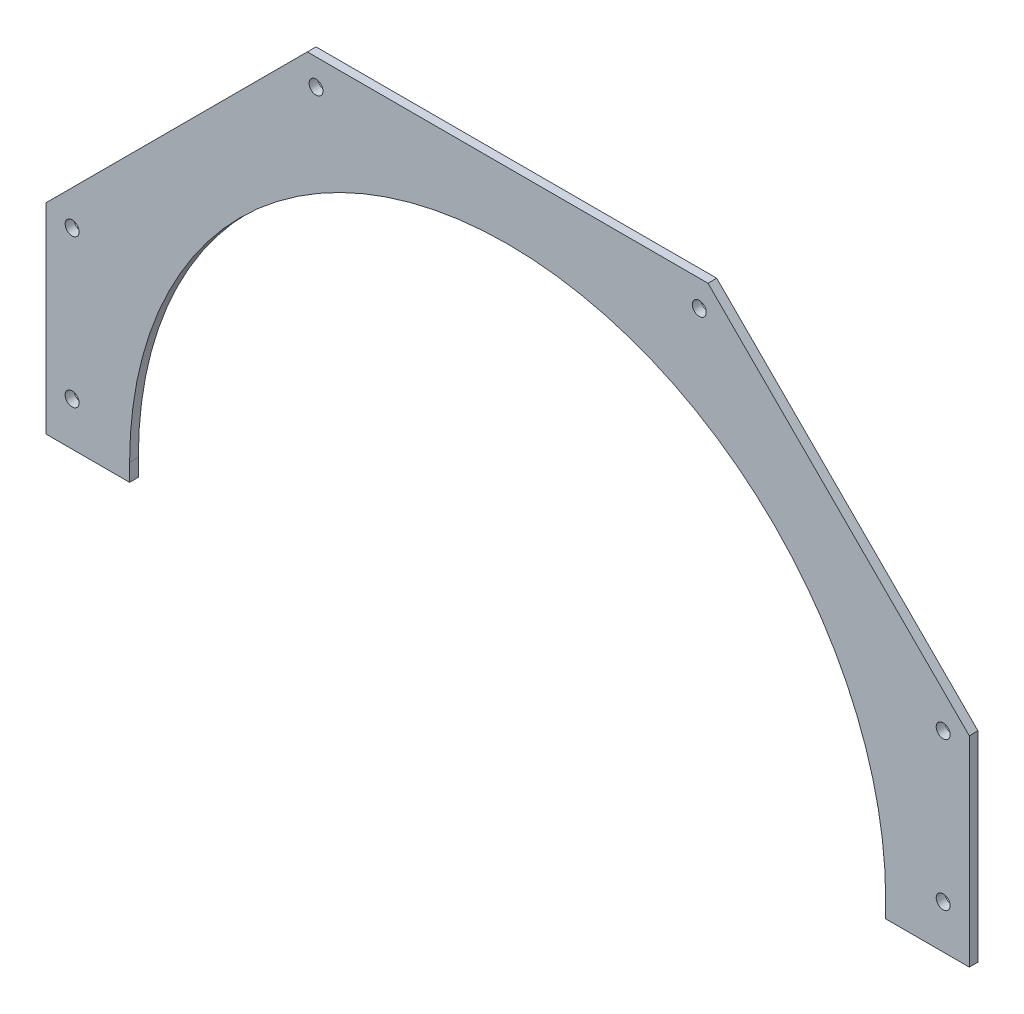
ISO-10303-21;
HEADER;
FILE_DESCRIPTION(('STEP AP214'),'2;1');
FILE_NAME('part.step','',(''),(''),'','','');
FILE_SCHEMA(('AUTOMOTIVE_DESIGN { 1 0 10303 214 1 1 1 1 }'));
ENDSEC;
DATA;
#1=APPLICATION_CONTEXT('core data for automotive mechanical design processes');
#2=APPLICATION_PROTOCOL_DEFINITION('international standard','automotive_design',2000,#1);
#3=PRODUCT_CONTEXT('',#1,'mechanical');
#4=PRODUCT('Part','Part','',(#3));
#5=PRODUCT_RELATED_PRODUCT_CATEGORY('part','',(#4));
#6=PRODUCT_DEFINITION_FORMATION('','',#4);
#7=PRODUCT_DEFINITION_CONTEXT('part definition',#1,'design');
#8=PRODUCT_DEFINITION('design','',#6,#7);
#9=PRODUCT_DEFINITION_SHAPE('','',#8);
#10=(LENGTH_UNIT() NAMED_UNIT(*) SI_UNIT(.MILLI.,.METRE.));
#11=(NAMED_UNIT(*) PLANE_ANGLE_UNIT() SI_UNIT($,.RADIAN.));
#12=(NAMED_UNIT(*) SI_UNIT($,.STERADIAN.) SOLID_ANGLE_UNIT());
#13=UNCERTAINTY_MEASURE_WITH_UNIT(LENGTH_MEASURE(1.E-05),#10,'distance_accuracy_value','');
#14=(GEOMETRIC_REPRESENTATION_CONTEXT(3) GLOBAL_UNCERTAINTY_ASSIGNED_CONTEXT((#13)) GLOBAL_UNIT_ASSIGNED_CONTEXT((#10,
#11,#12)) REPRESENTATION_CONTEXT('',''));
#15=CARTESIAN_POINT('',(0.,0.,0.));
#16=DIRECTION('',(0.,0.,1.));
#17=DIRECTION('',(1.,0.,0.));
#18=AXIS2_PLACEMENT_3D('',#15,#16,#17);
#19=CARTESIAN_POINT('',(0.,0.,10.));
#20=DIRECTION('',(0.,1.,0.));
#21=DIRECTION('',(0.,0.,1.));
#22=AXIS2_PLACEMENT_3D('',#19,#20,#21);
#23=PLANE('',#22);
#24=DIRECTION('',(1.,0.,0.));
#25=VECTOR('',#24,1.);
#26=CARTESIAN_POINT('',(0.,0.,10.));
#27=LINE('',#26,#25);
#28=CARTESIAN_POINT('',(964.,1.0629934216599E-13,10.));
#29=VERTEX_POINT('',#28);
#30=CARTESIAN_POINT('',(1060.,0.,10.));
#31=VERTEX_POINT('',#30);
#32=EDGE_CURVE('E161',#29,#31,#27,.T.);
#33=ORIENTED_EDGE('',*,*,#32,.F.);
#34=DIRECTION('',(0.,0.,1.));
#35=VECTOR('',#34,1.);
#36=CARTESIAN_POINT('',(964.,1.0629934216599E-13,0.));
#37=LINE('',#36,#35);
#38=CARTESIAN_POINT('',(964.,1.0629934216599E-13,0.));
#39=VERTEX_POINT('',#38);
#40=EDGE_CURVE('E156',#39,#29,#37,.T.);
#41=ORIENTED_EDGE('',*,*,#40,.F.);
#42=DIRECTION('',(1.,0.,0.));
#43=VECTOR('',#42,1.);
#44=CARTESIAN_POINT('',(0.,0.,0.));
#45=LINE('',#44,#43);
#46=CARTESIAN_POINT('',(1060.,0.,0.));
#47=VERTEX_POINT('',#46);
#48=EDGE_CURVE('E172',#39,#47,#45,.T.);
#49=ORIENTED_EDGE('',*,*,#48,.T.);
#50=DIRECTION('',(0.,0.,-1.));
#51=VECTOR('',#50,1.);
#52=CARTESIAN_POINT('',(1060.,0.,10.));
#53=LINE('',#52,#51);
#54=EDGE_CURVE('E170',#31,#47,#53,.T.);
#55=ORIENTED_EDGE('',*,*,#54,.F.);
#56=EDGE_LOOP('',(#33,#41,#49,#55));
#57=FACE_BOUND('',#56,.T.);
#58=ADVANCED_FACE('F35',(#57),#23,.F.);
#59=CARTESIAN_POINT('',(0.,0.,10.));
#60=DIRECTION('',(1.,0.,0.));
#61=DIRECTION('',(0.,0.,-1.));
#62=AXIS2_PLACEMENT_3D('',#59,#60,#61);
#63=PLANE('',#62);
#64=DIRECTION('',(0.,-1.,0.));
#65=VECTOR('',#64,1.);
#66=CARTESIAN_POINT('',(0.,0.,10.));
#67=LINE('',#66,#65);
#68=CARTESIAN_POINT('',(0.,230.,10.));
#69=VERTEX_POINT('',#68);
#70=CARTESIAN_POINT('',(0.,0.,10.));
#71=VERTEX_POINT('',#70);
#72=EDGE_CURVE('E159',#69,#71,#67,.T.);
#73=ORIENTED_EDGE('',*,*,#72,.F.);
#74=DIRECTION('',(0.,0.,-1.));
#75=VECTOR('',#74,1.);
#76=CARTESIAN_POINT('',(0.,230.,10.));
#77=LINE('',#76,#75);
#78=CARTESIAN_POINT('',(0.,230.,0.));
#79=VERTEX_POINT('',#78);
#80=EDGE_CURVE('E183',#69,#79,#77,.T.);
#81=ORIENTED_EDGE('',*,*,#80,.T.);
#82=DIRECTION('',(0.,-1.,0.));
#83=VECTOR('',#82,1.);
#84=CARTESIAN_POINT('',(0.,0.,0.));
#85=LINE('',#84,#83);
#86=CARTESIAN_POINT('',(0.,0.,0.));
#87=VERTEX_POINT('',#86);
#88=EDGE_CURVE('E155',#79,#87,#85,.T.);
#89=ORIENTED_EDGE('',*,*,#88,.T.);
#90=DIRECTION('',(0.,0.,-1.));
#91=VECTOR('',#90,1.);
#92=CARTESIAN_POINT('',(0.,0.,10.));
#93=LINE('',#92,#91);
#94=EDGE_CURVE('E180',#71,#87,#93,.T.);
#95=ORIENTED_EDGE('',*,*,#94,.F.);
#96=EDGE_LOOP('',(#73,#81,#89,#95));
#97=FACE_BOUND('',#96,.T.);
#98=ADVANCED_FACE('F248',(#97),#63,.F.);
#99=CARTESIAN_POINT('',(96.0000000000001,0.,0.));
#100=VERTEX_POINT('',#99);
#101=EDGE_CURVE('E173',#87,#100,#45,.T.);
#102=ORIENTED_EDGE('',*,*,#101,.T.);
#103=DIRECTION('',(0.,0.,1.));
#104=VECTOR('',#103,1.);
#105=CARTESIAN_POINT('',(96.0000000000001,0.,0.));
#106=LINE('',#105,#104);
#107=CARTESIAN_POINT('',(96.0000000000001,0.,10.));
#108=VERTEX_POINT('',#107);
#109=EDGE_CURVE('E126',#100,#108,#106,.T.);
#110=ORIENTED_EDGE('',*,*,#109,.T.);
#111=EDGE_CURVE('E163',#71,#108,#27,.T.);
#112=ORIENTED_EDGE('',*,*,#111,.F.);
#113=ORIENTED_EDGE('',*,*,#94,.T.);
#114=EDGE_LOOP('',(#102,#110,#112,#113));
#115=FACE_BOUND('',#114,.T.);
#116=ADVANCED_FACE('F253',(#115),#23,.F.);
#117=CARTESIAN_POINT('',(1060.,0.,10.));
#118=DIRECTION('',(-1.,0.,0.));
#119=DIRECTION('',(0.,0.,1.));
#120=AXIS2_PLACEMENT_3D('',#117,#118,#119);
#121=PLANE('',#120);
#122=DIRECTION('',(0.,1.,0.));
#123=VECTOR('',#122,1.);
#124=CARTESIAN_POINT('',(1060.,0.,0.));
#125=LINE('',#124,#123);
#126=CARTESIAN_POINT('',(1060.,229.999999999999,0.));
#127=VERTEX_POINT('',#126);
#128=EDGE_CURVE('E175',#47,#127,#125,.T.);
#129=ORIENTED_EDGE('',*,*,#128,.T.);
#130=DIRECTION('',(0.,0.,1.));
#131=VECTOR('',#130,1.);
#132=CARTESIAN_POINT('',(1060.,229.999999999999,10.));
#133=LINE('',#132,#131);
#134=CARTESIAN_POINT('',(1060.,229.999999999999,10.));
#135=VERTEX_POINT('',#134);
#136=EDGE_CURVE('E11',#127,#135,#133,.T.);
#137=ORIENTED_EDGE('',*,*,#136,.T.);
#138=DIRECTION('',(0.,1.,0.));
#139=VECTOR('',#138,1.);
#140=CARTESIAN_POINT('',(1060.,0.,10.));
#141=LINE('',#140,#139);
#142=EDGE_CURVE('E166',#31,#135,#141,.T.);
#143=ORIENTED_EDGE('',*,*,#142,.F.);
#144=ORIENTED_EDGE('',*,*,#54,.T.);
#145=EDGE_LOOP('',(#129,#137,#143,#144));
#146=FACE_BOUND('',#145,.T.);
#147=ADVANCED_FACE('F261',(#146),#121,.F.);
#148=CARTESIAN_POINT('',(0.,530.,10.));
#149=DIRECTION('',(0.,-1.,0.));
#150=DIRECTION('',(0.,0.,-1.));
#151=AXIS2_PLACEMENT_3D('',#148,#149,#150);
#152=PLANE('',#151);
#153=DIRECTION('',(-1.,0.,0.));
#154=VECTOR('',#153,1.);
#155=CARTESIAN_POINT('',(0.,530.,0.));
#156=LINE('',#155,#154);
#157=CARTESIAN_POINT('',(760.,530.,0.));
#158=VERTEX_POINT('',#157);
#159=CARTESIAN_POINT('',(300.000000000001,530.,0.));
#160=VERTEX_POINT('',#159);
#161=EDGE_CURVE('E162',#158,#160,#156,.T.);
#162=ORIENTED_EDGE('',*,*,#161,.T.);
#163=DIRECTION('',(0.,0.,1.));
#164=VECTOR('',#163,1.);
#165=CARTESIAN_POINT('',(300.000000000001,530.,10.));
#166=LINE('',#165,#164);
#167=CARTESIAN_POINT('',(300.000000000001,530.,10.));
#168=VERTEX_POINT('',#167);
#169=EDGE_CURVE('E58',#160,#168,#166,.T.);
#170=ORIENTED_EDGE('',*,*,#169,.T.);
#171=DIRECTION('',(-1.,0.,0.));
#172=VECTOR('',#171,1.);
#173=CARTESIAN_POINT('',(0.,530.,10.));
#174=LINE('',#173,#172);
#175=CARTESIAN_POINT('',(760.,530.,10.));
#176=VERTEX_POINT('',#175);
#177=EDGE_CURVE('E168',#176,#168,#174,.T.);
#178=ORIENTED_EDGE('',*,*,#177,.F.);
#179=DIRECTION('',(0.,0.,-1.));
#180=VECTOR('',#179,1.);
#181=CARTESIAN_POINT('',(760.,530.,10.));
#182=LINE('',#181,#180);
#183=EDGE_CURVE('E190',#176,#158,#182,.T.);
#184=ORIENTED_EDGE('',*,*,#183,.T.);
#185=EDGE_LOOP('',(#162,#170,#178,#184));
#186=FACE_BOUND('',#185,.T.);
#187=ADVANCED_FACE('F234',(#186),#152,.F.);
#188=CARTESIAN_POINT('',(0.,0.,10.));
#189=DIRECTION('',(0.,0.,-1.));
#190=DIRECTION('',(-1.,0.,0.));
#191=AXIS2_PLACEMENT_3D('',#188,#189,#190);
#192=PLANE('',#191);
#193=CARTESIAN_POINT('',(30.,220.,10.));
#194=DIRECTION('',(0.,0.,1.));
#195=DIRECTION('',(1.,0.,0.));
#196=AXIS2_PLACEMENT_3D('',#193,#194,#195);
#197=CIRCLE('',#196,7.99999999999999);
#198=CARTESIAN_POINT('',(38.,220.,10.));
#199=VERTEX_POINT('',#198);
#200=EDGE_CURVE('E220',#199,#199,#197,.T.);
#201=ORIENTED_EDGE('',*,*,#200,.F.);
#202=EDGE_LOOP('',(#201));
#203=FACE_BOUND('',#202,.T.);
#204=CARTESIAN_POINT('',(30.,50.,10.));
#205=DIRECTION('',(0.,0.,1.));
#206=DIRECTION('',(1.,0.,0.));
#207=AXIS2_PLACEMENT_3D('',#204,#205,#206);
#208=CIRCLE('',#207,7.99999999999999);
#209=CARTESIAN_POINT('',(38.,50.,10.));
#210=VERTEX_POINT('',#209);
#211=EDGE_CURVE('E209',#210,#210,#208,.T.);
#212=ORIENTED_EDGE('',*,*,#211,.F.);
#213=EDGE_LOOP('',(#212));
#214=FACE_BOUND('',#213,.T.);
#215=CARTESIAN_POINT('',(1030.,220.,10.));
#216=DIRECTION('',(0.,0.,1.));
#217=DIRECTION('',(1.,0.,0.));
#218=AXIS2_PLACEMENT_3D('',#215,#216,#217);
#219=CIRCLE('',#218,8.00000000000001);
#220=CARTESIAN_POINT('',(1038.,220.,10.));
#221=VERTEX_POINT('',#220);
#222=EDGE_CURVE('E208',#221,#221,#219,.T.);
#223=ORIENTED_EDGE('',*,*,#222,.F.);
#224=EDGE_LOOP('',(#223));
#225=FACE_BOUND('',#224,.T.);
#226=CARTESIAN_POINT('',(1030.,50.,10.));
#227=DIRECTION('',(0.,0.,1.));
#228=DIRECTION('',(1.,0.,0.));
#229=AXIS2_PLACEMENT_3D('',#226,#227,#228);
#230=CIRCLE('',#229,8.00000000000001);
#231=CARTESIAN_POINT('',(1038.,50.,10.));
#232=VERTEX_POINT('',#231);
#233=EDGE_CURVE('E205',#232,#232,#230,.T.);
#234=ORIENTED_EDGE('',*,*,#233,.F.);
#235=EDGE_LOOP('',(#234));
#236=FACE_BOUND('',#235,.T.);
#237=CARTESIAN_POINT('',(310.,500.,10.));
#238=DIRECTION('',(0.,0.,1.));
#239=DIRECTION('',(1.,0.,0.));
#240=AXIS2_PLACEMENT_3D('',#237,#238,#239);
#241=CIRCLE('',#240,8.00000000000001);
#242=CARTESIAN_POINT('',(318.,500.,10.));
#243=VERTEX_POINT('',#242);
#244=EDGE_CURVE('E202',#243,#243,#241,.T.);
#245=ORIENTED_EDGE('',*,*,#244,.F.);
#246=EDGE_LOOP('',(#245));
#247=FACE_BOUND('',#246,.T.);
#248=CARTESIAN_POINT('',(750.,500.,10.));
#249=DIRECTION('',(0.,0.,1.));
#250=DIRECTION('',(1.,0.,0.));
#251=AXIS2_PLACEMENT_3D('',#248,#249,#250);
#252=CIRCLE('',#251,8.00000000000001);
#253=CARTESIAN_POINT('',(758.,500.,10.));
#254=VERTEX_POINT('',#253);
#255=EDGE_CURVE('E146',#254,#254,#252,.T.);
#256=ORIENTED_EDGE('',*,*,#255,.F.);
#257=EDGE_LOOP('',(#256));
#258=FACE_BOUND('',#257,.T.);
#259=ORIENTED_EDGE('',*,*,#177,.T.);
#260=DIRECTION('',(0.707106781186549,0.707106781186546,0.));
#261=VECTOR('',#260,1.);
#262=CARTESIAN_POINT('',(0.,230.,10.));
#263=LINE('',#262,#261);
#264=EDGE_CURVE('E44',#168,#69,#263,.F.);
#265=ORIENTED_EDGE('',*,*,#264,.T.);
#266=ORIENTED_EDGE('',*,*,#72,.T.);
#267=ORIENTED_EDGE('',*,*,#111,.T.);
#268=DIRECTION('',(0.,-1.,0.));
#269=VECTOR('',#268,1.);
#270=CARTESIAN_POINT('',(96.0000000000001,20.0000000000001,10.));
#271=LINE('',#270,#269);
#272=CARTESIAN_POINT('',(96.0000000000001,20.0000000000001,10.));
#273=VERTEX_POINT('',#272);
#274=EDGE_CURVE('E143',#273,#108,#271,.T.);
#275=ORIENTED_EDGE('',*,*,#274,.F.);
#276=CARTESIAN_POINT('',(530.,20.0000000000001,10.));
#277=DIRECTION('',(0.,0.,1.));
#278=DIRECTION('',(1.,0.,0.));
#279=AXIS2_PLACEMENT_3D('',#276,#277,#278);
#280=CIRCLE('',#279,434.);
#281=CARTESIAN_POINT('',(964.,20.0000000000002,10.));
#282=VERTEX_POINT('',#281);
#283=EDGE_CURVE('E123',#282,#273,#280,.T.);
#284=ORIENTED_EDGE('',*,*,#283,.F.);
#285=DIRECTION('',(0.,1.,0.));
#286=VECTOR('',#285,1.);
#287=CARTESIAN_POINT('',(964.,20.0000000000002,10.));
#288=LINE('',#287,#286);
#289=EDGE_CURVE('E140',#29,#282,#288,.T.);
#290=ORIENTED_EDGE('',*,*,#289,.F.);
#291=ORIENTED_EDGE('',*,*,#32,.T.);
#292=ORIENTED_EDGE('',*,*,#142,.T.);
#293=DIRECTION('',(0.707106781186546,-0.707106781186549,0.));
#294=VECTOR('',#293,1.);
#295=CARTESIAN_POINT('',(760.,530.,10.));
#296=LINE('',#295,#294);
#297=EDGE_CURVE('E194',#135,#176,#296,.F.);
#298=ORIENTED_EDGE('',*,*,#297,.T.);
#299=EDGE_LOOP('',(#259,#265,#266,#267,#275,#284,#290,#291,#292,#298));
#300=FACE_BOUND('',#299,.T.);
#301=ADVANCED_FACE('F231',(#203,#214,#225,#236,#247,#258,#300),#192,.F.);
#302=CARTESIAN_POINT('',(0.,0.,0.));
#303=DIRECTION('',(0.,0.,-1.));
#304=DIRECTION('',(-1.,0.,0.));
#305=AXIS2_PLACEMENT_3D('',#302,#303,#304);
#306=PLANE('',#305);
#307=CARTESIAN_POINT('',(30.,220.,0.));
#308=DIRECTION('',(0.,0.,-1.));
#309=DIRECTION('',(-1.,0.,0.));
#310=AXIS2_PLACEMENT_3D('',#307,#308,#309);
#311=CIRCLE('',#310,7.99999999999999);
#312=CARTESIAN_POINT('',(22.,220.,0.));
#313=VERTEX_POINT('',#312);
#314=EDGE_CURVE('E39',#313,#313,#311,.T.);
#315=ORIENTED_EDGE('',*,*,#314,.F.);
#316=EDGE_LOOP('',(#315));
#317=FACE_BOUND('',#316,.T.);
#318=CARTESIAN_POINT('',(30.,50.,0.));
#319=DIRECTION('',(0.,0.,-1.));
#320=DIRECTION('',(-1.,0.,0.));
#321=AXIS2_PLACEMENT_3D('',#318,#319,#320);
#322=CIRCLE('',#321,7.99999999999999);
#323=CARTESIAN_POINT('',(22.,50.,0.));
#324=VERTEX_POINT('',#323);
#325=EDGE_CURVE('E206',#324,#324,#322,.T.);
#326=ORIENTED_EDGE('',*,*,#325,.F.);
#327=EDGE_LOOP('',(#326));
#328=FACE_BOUND('',#327,.T.);
#329=CARTESIAN_POINT('',(1030.,220.,0.));
#330=DIRECTION('',(0.,0.,-1.));
#331=DIRECTION('',(-1.,0.,0.));
#332=AXIS2_PLACEMENT_3D('',#329,#330,#331);
#333=CIRCLE('',#332,8.00000000000001);
#334=CARTESIAN_POINT('',(1022.,220.,0.));
#335=VERTEX_POINT('',#334);
#336=EDGE_CURVE('E213',#335,#335,#333,.T.);
#337=ORIENTED_EDGE('',*,*,#336,.F.);
#338=EDGE_LOOP('',(#337));
#339=FACE_BOUND('',#338,.T.);
#340=CARTESIAN_POINT('',(1030.,50.,0.));
#341=DIRECTION('',(0.,0.,-1.));
#342=DIRECTION('',(-1.,0.,0.));
#343=AXIS2_PLACEMENT_3D('',#340,#341,#342);
#344=CIRCLE('',#343,8.00000000000001);
#345=CARTESIAN_POINT('',(1022.,50.,0.));
#346=VERTEX_POINT('',#345);
#347=EDGE_CURVE('E203',#346,#346,#344,.T.);
#348=ORIENTED_EDGE('',*,*,#347,.F.);
#349=EDGE_LOOP('',(#348));
#350=FACE_BOUND('',#349,.T.);
#351=CARTESIAN_POINT('',(310.,500.,0.));
#352=DIRECTION('',(0.,0.,-1.));
#353=DIRECTION('',(-1.,0.,0.));
#354=AXIS2_PLACEMENT_3D('',#351,#352,#353);
#355=CIRCLE('',#354,8.00000000000001);
#356=CARTESIAN_POINT('',(302.,500.,0.));
#357=VERTEX_POINT('',#356);
#358=EDGE_CURVE('E199',#357,#357,#355,.T.);
#359=ORIENTED_EDGE('',*,*,#358,.F.);
#360=EDGE_LOOP('',(#359));
#361=FACE_BOUND('',#360,.T.);
#362=CARTESIAN_POINT('',(750.,500.,0.));
#363=DIRECTION('',(0.,0.,-1.));
#364=DIRECTION('',(-1.,0.,0.));
#365=AXIS2_PLACEMENT_3D('',#362,#363,#364);
#366=CIRCLE('',#365,8.00000000000001);
#367=CARTESIAN_POINT('',(742.,500.,0.));
#368=VERTEX_POINT('',#367);
#369=EDGE_CURVE('E151',#368,#368,#366,.T.);
#370=ORIENTED_EDGE('',*,*,#369,.F.);
#371=EDGE_LOOP('',(#370));
#372=FACE_BOUND('',#371,.T.);
#373=ORIENTED_EDGE('',*,*,#88,.F.);
#374=DIRECTION('',(-0.707106781186549,-0.707106781186546,0.));
#375=VECTOR('',#374,1.);
#376=CARTESIAN_POINT('',(-115.,115.,0.));
#377=LINE('',#376,#375);
#378=EDGE_CURVE('E188',#79,#160,#377,.F.);
#379=ORIENTED_EDGE('',*,*,#378,.T.);
#380=ORIENTED_EDGE('',*,*,#161,.F.);
#381=DIRECTION('',(-0.707106781186546,0.707106781186549,0.));
#382=VECTOR('',#381,1.);
#383=CARTESIAN_POINT('',(645.000000000002,644.999999999999,0.));
#384=LINE('',#383,#382);
#385=EDGE_CURVE('E186',#158,#127,#384,.F.);
#386=ORIENTED_EDGE('',*,*,#385,.T.);
#387=ORIENTED_EDGE('',*,*,#128,.F.);
#388=ORIENTED_EDGE('',*,*,#48,.F.);
#389=DIRECTION('',(0.,1.,0.));
#390=VECTOR('',#389,1.);
#391=CARTESIAN_POINT('',(964.,20.0000000000002,0.));
#392=LINE('',#391,#390);
#393=CARTESIAN_POINT('',(964.,20.0000000000002,0.));
#394=VERTEX_POINT('',#393);
#395=EDGE_CURVE('E127',#39,#394,#392,.T.);
#396=ORIENTED_EDGE('',*,*,#395,.T.);
#397=CARTESIAN_POINT('',(530.,20.0000000000001,0.));
#398=DIRECTION('',(0.,0.,1.));
#399=DIRECTION('',(1.,0.,0.));
#400=AXIS2_PLACEMENT_3D('',#397,#398,#399);
#401=CIRCLE('',#400,434.);
#402=CARTESIAN_POINT('',(96.0000000000001,20.0000000000001,0.));
#403=VERTEX_POINT('',#402);
#404=EDGE_CURVE('E120',#394,#403,#401,.T.);
#405=ORIENTED_EDGE('',*,*,#404,.T.);
#406=DIRECTION('',(0.,-1.,0.));
#407=VECTOR('',#406,1.);
#408=CARTESIAN_POINT('',(96.0000000000001,20.0000000000001,0.));
#409=LINE('',#408,#407);
#410=EDGE_CURVE('E130',#403,#100,#409,.T.);
#411=ORIENTED_EDGE('',*,*,#410,.T.);
#412=ORIENTED_EDGE('',*,*,#101,.F.);
#413=EDGE_LOOP('',(#373,#379,#380,#386,#387,#388,#396,#405,#411,#412));
#414=FACE_BOUND('',#413,.T.);
#415=ADVANCED_FACE('F138',(#317,#328,#339,#350,#361,#372,#414),#306,.T.);
#416=CARTESIAN_POINT('',(530.,20.0000000000001,0.));
#417=DIRECTION('',(0.,0.,1.));
#418=DIRECTION('',(1.,0.,0.));
#419=AXIS2_PLACEMENT_3D('',#416,#417,#418);
#420=CYLINDRICAL_SURFACE('',#419,434.);
#421=ORIENTED_EDGE('',*,*,#283,.T.);
#422=DIRECTION('',(0.,0.,1.));
#423=VECTOR('',#422,1.);
#424=CARTESIAN_POINT('',(96.0000000000001,20.0000000000001,0.));
#425=LINE('',#424,#423);
#426=EDGE_CURVE('E116',#403,#273,#425,.T.);
#427=ORIENTED_EDGE('',*,*,#426,.F.);
#428=ORIENTED_EDGE('',*,*,#404,.F.);
#429=DIRECTION('',(0.,0.,1.));
#430=VECTOR('',#429,1.);
#431=CARTESIAN_POINT('',(964.,20.0000000000002,0.));
#432=LINE('',#431,#430);
#433=EDGE_CURVE('E153',#394,#282,#432,.T.);
#434=ORIENTED_EDGE('',*,*,#433,.T.);
#435=EDGE_LOOP('',(#421,#427,#428,#434));
#436=FACE_BOUND('',#435,.T.);
#437=ADVANCED_FACE('F118',(#436),#420,.F.);
#438=CARTESIAN_POINT('',(964.,20.0000000000002,0.));
#439=DIRECTION('',(1.,0.,0.));
#440=DIRECTION('',(0.,0.,-1.));
#441=AXIS2_PLACEMENT_3D('',#438,#439,#440);
#442=PLANE('',#441);
#443=ORIENTED_EDGE('',*,*,#289,.T.);
#444=ORIENTED_EDGE('',*,*,#433,.F.);
#445=ORIENTED_EDGE('',*,*,#395,.F.);
#446=ORIENTED_EDGE('',*,*,#40,.T.);
#447=EDGE_LOOP('',(#443,#444,#445,#446));
#448=FACE_BOUND('',#447,.T.);
#449=ADVANCED_FACE('F384',(#448),#442,.F.);
#450=CARTESIAN_POINT('',(96.0000000000001,20.0000000000001,0.));
#451=DIRECTION('',(-1.,0.,0.));
#452=DIRECTION('',(0.,0.,1.));
#453=AXIS2_PLACEMENT_3D('',#450,#451,#452);
#454=PLANE('',#453);
#455=ORIENTED_EDGE('',*,*,#274,.T.);
#456=ORIENTED_EDGE('',*,*,#109,.F.);
#457=ORIENTED_EDGE('',*,*,#410,.F.);
#458=ORIENTED_EDGE('',*,*,#426,.T.);
#459=EDGE_LOOP('',(#455,#456,#457,#458));
#460=FACE_BOUND('',#459,.T.);
#461=ADVANCED_FACE('F131',(#460),#454,.F.);
#462=CARTESIAN_POINT('',(0.,230.,10.));
#463=DIRECTION('',(0.707106781186546,-0.707106781186549,0.));
#464=DIRECTION('',(0.,0.,-1.));
#465=AXIS2_PLACEMENT_3D('',#462,#463,#464);
#466=PLANE('',#465);
#467=ORIENTED_EDGE('',*,*,#264,.F.);
#468=ORIENTED_EDGE('',*,*,#169,.F.);
#469=ORIENTED_EDGE('',*,*,#378,.F.);
#470=ORIENTED_EDGE('',*,*,#80,.F.);
#471=EDGE_LOOP('',(#467,#468,#469,#470));
#472=FACE_BOUND('',#471,.T.);
#473=ADVANCED_FACE('F246',(#472),#466,.F.);
#474=CARTESIAN_POINT('',(760.,530.,10.));
#475=DIRECTION('',(-0.707106781186549,-0.707106781186546,0.));
#476=DIRECTION('',(0.,0.,-1.));
#477=AXIS2_PLACEMENT_3D('',#474,#475,#476);
#478=PLANE('',#477);
#479=ORIENTED_EDGE('',*,*,#297,.F.);
#480=ORIENTED_EDGE('',*,*,#136,.F.);
#481=ORIENTED_EDGE('',*,*,#385,.F.);
#482=ORIENTED_EDGE('',*,*,#183,.F.);
#483=EDGE_LOOP('',(#479,#480,#481,#482));
#484=FACE_BOUND('',#483,.T.);
#485=ADVANCED_FACE('F37',(#484),#478,.F.);
#486=CARTESIAN_POINT('',(750.,500.,10.));
#487=DIRECTION('',(0.,0.,1.));
#488=DIRECTION('',(1.,0.,0.));
#489=AXIS2_PLACEMENT_3D('',#486,#487,#488);
#490=CYLINDRICAL_SURFACE('',#489,8.00000000000001);
#491=ORIENTED_EDGE('',*,*,#369,.T.);
#492=EDGE_LOOP('',(#491));
#493=FACE_BOUND('',#492,.T.);
#494=ORIENTED_EDGE('',*,*,#255,.T.);
#495=EDGE_LOOP('',(#494));
#496=FACE_BOUND('',#495,.T.);
#497=ADVANCED_FACE('F312',(#493,#496),#490,.F.);
#498=CARTESIAN_POINT('',(310.,500.,10.));
#499=DIRECTION('',(0.,0.,1.));
#500=DIRECTION('',(1.,0.,0.));
#501=AXIS2_PLACEMENT_3D('',#498,#499,#500);
#502=CYLINDRICAL_SURFACE('',#501,8.00000000000001);
#503=ORIENTED_EDGE('',*,*,#358,.T.);
#504=EDGE_LOOP('',(#503));
#505=FACE_BOUND('',#504,.T.);
#506=ORIENTED_EDGE('',*,*,#244,.T.);
#507=EDGE_LOOP('',(#506));
#508=FACE_BOUND('',#507,.T.);
#509=ADVANCED_FACE('F229',(#505,#508),#502,.F.);
#510=CARTESIAN_POINT('',(1030.,50.,10.));
#511=DIRECTION('',(0.,0.,1.));
#512=DIRECTION('',(1.,0.,0.));
#513=AXIS2_PLACEMENT_3D('',#510,#511,#512);
#514=CYLINDRICAL_SURFACE('',#513,8.00000000000001);
#515=ORIENTED_EDGE('',*,*,#347,.T.);
#516=EDGE_LOOP('',(#515));
#517=FACE_BOUND('',#516,.T.);
#518=ORIENTED_EDGE('',*,*,#233,.T.);
#519=EDGE_LOOP('',(#518));
#520=FACE_BOUND('',#519,.T.);
#521=ADVANCED_FACE('F339',(#517,#520),#514,.F.);
#522=CARTESIAN_POINT('',(1030.,220.,10.));
#523=DIRECTION('',(0.,0.,1.));
#524=DIRECTION('',(1.,0.,0.));
#525=AXIS2_PLACEMENT_3D('',#522,#523,#524);
#526=CYLINDRICAL_SURFACE('',#525,8.00000000000001);
#527=ORIENTED_EDGE('',*,*,#336,.T.);
#528=EDGE_LOOP('',(#527));
#529=FACE_BOUND('',#528,.T.);
#530=ORIENTED_EDGE('',*,*,#222,.T.);
#531=EDGE_LOOP('',(#530));
#532=FACE_BOUND('',#531,.T.);
#533=ADVANCED_FACE('F349',(#529,#532),#526,.F.);
#534=CARTESIAN_POINT('',(30.,50.,10.));
#535=DIRECTION('',(0.,0.,1.));
#536=DIRECTION('',(1.,0.,0.));
#537=AXIS2_PLACEMENT_3D('',#534,#535,#536);
#538=CYLINDRICAL_SURFACE('',#537,7.99999999999999);
#539=ORIENTED_EDGE('',*,*,#325,.T.);
#540=EDGE_LOOP('',(#539));
#541=FACE_BOUND('',#540,.T.);
#542=ORIENTED_EDGE('',*,*,#211,.T.);
#543=EDGE_LOOP('',(#542));
#544=FACE_BOUND('',#543,.T.);
#545=ADVANCED_FACE('F359',(#541,#544),#538,.F.);
#546=CARTESIAN_POINT('',(30.,220.,10.));
#547=DIRECTION('',(0.,0.,1.));
#548=DIRECTION('',(1.,0.,0.));
#549=AXIS2_PLACEMENT_3D('',#546,#547,#548);
#550=CYLINDRICAL_SURFACE('',#549,7.99999999999999);
#551=ORIENTED_EDGE('',*,*,#314,.T.);
#552=EDGE_LOOP('',(#551));
#553=FACE_BOUND('',#552,.T.);
#554=ORIENTED_EDGE('',*,*,#200,.T.);
#555=EDGE_LOOP('',(#554));
#556=FACE_BOUND('',#555,.T.);
#557=ADVANCED_FACE('F369',(#553,#556),#550,.F.);
#558=CLOSED_SHELL('',(#58,#98,#116,#147,#187,#301,#415,#437,#449,#461,#473,#485,#497,#509,#521,
#533,#545,#557));
#559=MANIFOLD_SOLID_BREP('B2',#558);
#560=ADVANCED_BREP_SHAPE_REPRESENTATION('',(#18,#559),#14);
#561=SHAPE_DEFINITION_REPRESENTATION(#9,#560);
ENDSEC;
END-ISO-10303-21;
